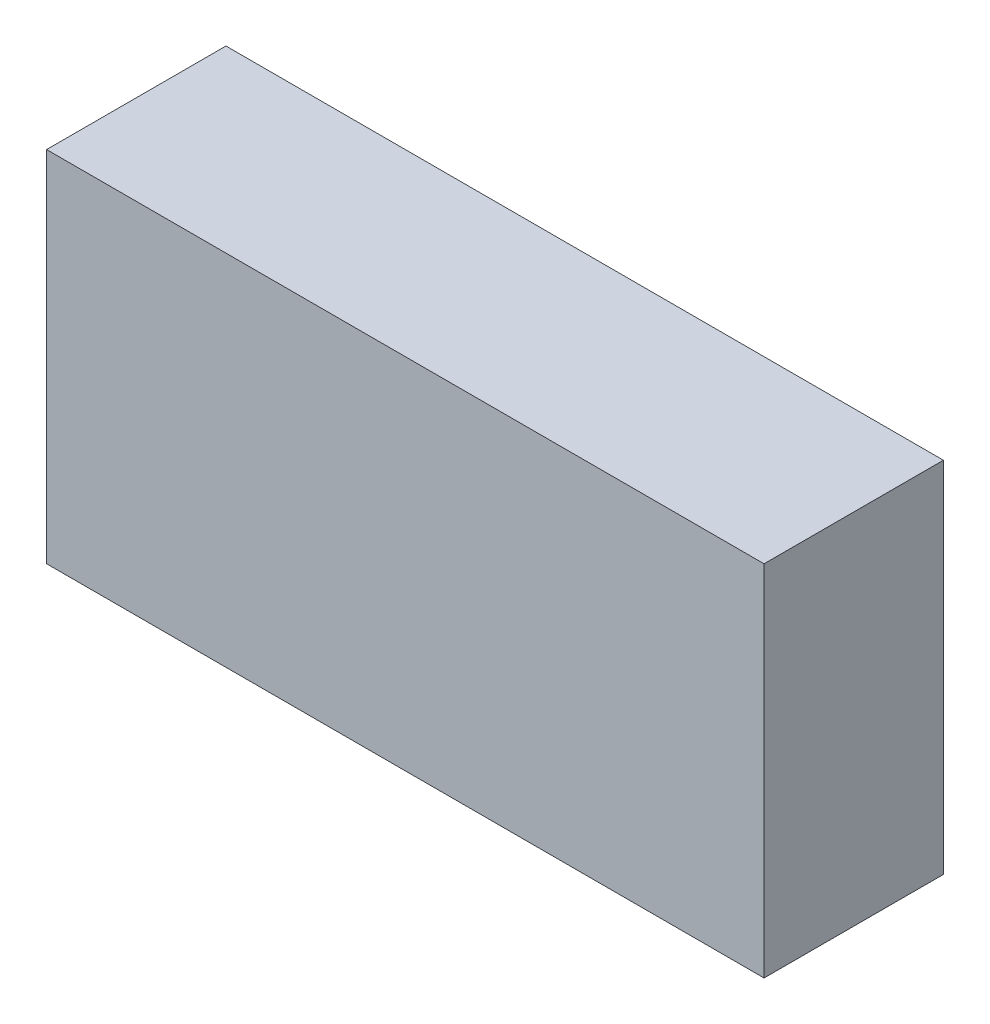
ISO-10303-21;
HEADER;
FILE_DESCRIPTION(('STEP AP214'),'2;1');
FILE_NAME('part.step','',(''),(''),'','','');
FILE_SCHEMA(('AUTOMOTIVE_DESIGN { 1 0 10303 214 1 1 1 1 }'));
ENDSEC;
DATA;
#1=APPLICATION_CONTEXT('core data for automotive mechanical design processes');
#2=APPLICATION_PROTOCOL_DEFINITION('international standard','automotive_design',2000,#1);
#3=PRODUCT_CONTEXT('',#1,'mechanical');
#4=PRODUCT('Part','Part','',(#3));
#5=PRODUCT_RELATED_PRODUCT_CATEGORY('part','',(#4));
#6=PRODUCT_DEFINITION_FORMATION('','',#4);
#7=PRODUCT_DEFINITION_CONTEXT('part definition',#1,'design');
#8=PRODUCT_DEFINITION('design','',#6,#7);
#9=PRODUCT_DEFINITION_SHAPE('','',#8);
#10=(LENGTH_UNIT() NAMED_UNIT(*) SI_UNIT(.MILLI.,.METRE.));
#11=(NAMED_UNIT(*) PLANE_ANGLE_UNIT() SI_UNIT($,.RADIAN.));
#12=(NAMED_UNIT(*) SI_UNIT($,.STERADIAN.) SOLID_ANGLE_UNIT());
#13=UNCERTAINTY_MEASURE_WITH_UNIT(LENGTH_MEASURE(1.E-05),#10,'distance_accuracy_value','');
#14=(GEOMETRIC_REPRESENTATION_CONTEXT(3) GLOBAL_UNCERTAINTY_ASSIGNED_CONTEXT((#13)) GLOBAL_UNIT_ASSIGNED_CONTEXT((#10,
#11,#12)) REPRESENTATION_CONTEXT('',''));
#15=CARTESIAN_POINT('',(0.,0.,0.));
#16=DIRECTION('',(0.,0.,1.));
#17=DIRECTION('',(1.,0.,0.));
#18=AXIS2_PLACEMENT_3D('',#15,#16,#17);
#19=CARTESIAN_POINT('',(0.,0.,10.));
#20=DIRECTION('',(1.,0.,0.));
#21=DIRECTION('',(0.,0.,-1.));
#22=AXIS2_PLACEMENT_3D('',#19,#20,#21);
#23=PLANE('',#22);
#24=DIRECTION('',(0.,-1.,0.));
#25=VECTOR('',#24,1.);
#26=CARTESIAN_POINT('',(0.,0.,0.));
#27=LINE('',#26,#25);
#28=CARTESIAN_POINT('',(0.,20.,0.));
#29=VERTEX_POINT('',#28);
#30=CARTESIAN_POINT('',(0.,0.,0.));
#31=VERTEX_POINT('',#30);
#32=EDGE_CURVE('E106',#29,#31,#27,.T.);
#33=ORIENTED_EDGE('',*,*,#32,.T.);
#34=DIRECTION('',(0.,0.,-1.));
#35=VECTOR('',#34,1.);
#36=CARTESIAN_POINT('',(0.,0.,10.));
#37=LINE('',#36,#35);
#38=CARTESIAN_POINT('',(0.,0.,10.));
#39=VERTEX_POINT('',#38);
#40=EDGE_CURVE('E11',#39,#31,#37,.T.);
#41=ORIENTED_EDGE('',*,*,#40,.F.);
#42=DIRECTION('',(0.,-1.,0.));
#43=VECTOR('',#42,1.);
#44=CARTESIAN_POINT('',(0.,0.,10.));
#45=LINE('',#44,#43);
#46=CARTESIAN_POINT('',(0.,20.,10.));
#47=VERTEX_POINT('',#46);
#48=EDGE_CURVE('E92',#47,#39,#45,.T.);
#49=ORIENTED_EDGE('',*,*,#48,.F.);
#50=DIRECTION('',(0.,0.,-1.));
#51=VECTOR('',#50,1.);
#52=CARTESIAN_POINT('',(0.,20.,10.));
#53=LINE('',#52,#51);
#54=EDGE_CURVE('E105',#47,#29,#53,.T.);
#55=ORIENTED_EDGE('',*,*,#54,.T.);
#56=EDGE_LOOP('',(#33,#41,#49,#55));
#57=FACE_BOUND('',#56,.T.);
#58=ADVANCED_FACE('F43',(#57),#23,.F.);
#59=CARTESIAN_POINT('',(0.,0.,10.));
#60=DIRECTION('',(0.,1.,0.));
#61=DIRECTION('',(0.,0.,1.));
#62=AXIS2_PLACEMENT_3D('',#59,#60,#61);
#63=PLANE('',#62);
#64=DIRECTION('',(1.,0.,0.));
#65=VECTOR('',#64,1.);
#66=CARTESIAN_POINT('',(0.,0.,0.));
#67=LINE('',#66,#65);
#68=CARTESIAN_POINT('',(40.,0.,0.));
#69=VERTEX_POINT('',#68);
#70=EDGE_CURVE('E97',#31,#69,#67,.T.);
#71=ORIENTED_EDGE('',*,*,#70,.T.);
#72=DIRECTION('',(0.,0.,-1.));
#73=VECTOR('',#72,1.);
#74=CARTESIAN_POINT('',(40.,0.,10.));
#75=LINE('',#74,#73);
#76=CARTESIAN_POINT('',(40.,0.,10.));
#77=VERTEX_POINT('',#76);
#78=EDGE_CURVE('E51',#77,#69,#75,.T.);
#79=ORIENTED_EDGE('',*,*,#78,.F.);
#80=DIRECTION('',(1.,0.,0.));
#81=VECTOR('',#80,1.);
#82=CARTESIAN_POINT('',(0.,0.,10.));
#83=LINE('',#82,#81);
#84=EDGE_CURVE('E87',#39,#77,#83,.T.);
#85=ORIENTED_EDGE('',*,*,#84,.F.);
#86=ORIENTED_EDGE('',*,*,#40,.T.);
#87=EDGE_LOOP('',(#71,#79,#85,#86));
#88=FACE_BOUND('',#87,.T.);
#89=ADVANCED_FACE('F100',(#88),#63,.F.);
#90=CARTESIAN_POINT('',(40.,0.,10.));
#91=DIRECTION('',(-1.,0.,0.));
#92=DIRECTION('',(0.,0.,1.));
#93=AXIS2_PLACEMENT_3D('',#90,#91,#92);
#94=PLANE('',#93);
#95=DIRECTION('',(0.,1.,0.));
#96=VECTOR('',#95,1.);
#97=CARTESIAN_POINT('',(40.,0.,0.));
#98=LINE('',#97,#96);
#99=CARTESIAN_POINT('',(40.,20.,0.));
#100=VERTEX_POINT('',#99);
#101=EDGE_CURVE('E78',#69,#100,#98,.T.);
#102=ORIENTED_EDGE('',*,*,#101,.T.);
#103=DIRECTION('',(0.,0.,-1.));
#104=VECTOR('',#103,1.);
#105=CARTESIAN_POINT('',(40.,20.,10.));
#106=LINE('',#105,#104);
#107=CARTESIAN_POINT('',(40.,20.,10.));
#108=VERTEX_POINT('',#107);
#109=EDGE_CURVE('E98',#108,#100,#106,.T.);
#110=ORIENTED_EDGE('',*,*,#109,.F.);
#111=DIRECTION('',(0.,1.,0.));
#112=VECTOR('',#111,1.);
#113=CARTESIAN_POINT('',(40.,0.,10.));
#114=LINE('',#113,#112);
#115=EDGE_CURVE('E95',#77,#108,#114,.T.);
#116=ORIENTED_EDGE('',*,*,#115,.F.);
#117=ORIENTED_EDGE('',*,*,#78,.T.);
#118=EDGE_LOOP('',(#102,#110,#116,#117));
#119=FACE_BOUND('',#118,.T.);
#120=ADVANCED_FACE('F99',(#119),#94,.F.);
#121=CARTESIAN_POINT('',(0.,20.,10.));
#122=DIRECTION('',(0.,-1.,0.));
#123=DIRECTION('',(0.,0.,-1.));
#124=AXIS2_PLACEMENT_3D('',#121,#122,#123);
#125=PLANE('',#124);
#126=DIRECTION('',(-1.,0.,0.));
#127=VECTOR('',#126,1.);
#128=CARTESIAN_POINT('',(0.,20.,0.));
#129=LINE('',#128,#127);
#130=EDGE_CURVE('E85',#100,#29,#129,.T.);
#131=ORIENTED_EDGE('',*,*,#130,.T.);
#132=ORIENTED_EDGE('',*,*,#54,.F.);
#133=DIRECTION('',(-1.,0.,0.));
#134=VECTOR('',#133,1.);
#135=CARTESIAN_POINT('',(0.,20.,10.));
#136=LINE('',#135,#134);
#137=EDGE_CURVE('E56',#108,#47,#136,.T.);
#138=ORIENTED_EDGE('',*,*,#137,.F.);
#139=ORIENTED_EDGE('',*,*,#109,.T.);
#140=EDGE_LOOP('',(#131,#132,#138,#139));
#141=FACE_BOUND('',#140,.T.);
#142=ADVANCED_FACE('F111',(#141),#125,.F.);
#143=CARTESIAN_POINT('',(0.,0.,10.));
#144=DIRECTION('',(0.,0.,-1.));
#145=DIRECTION('',(-1.,0.,0.));
#146=AXIS2_PLACEMENT_3D('',#143,#144,#145);
#147=PLANE('',#146);
#148=ORIENTED_EDGE('',*,*,#48,.T.);
#149=ORIENTED_EDGE('',*,*,#84,.T.);
#150=ORIENTED_EDGE('',*,*,#115,.T.);
#151=ORIENTED_EDGE('',*,*,#137,.T.);
#152=EDGE_LOOP('',(#148,#149,#150,#151));
#153=FACE_BOUND('',#152,.T.);
#154=ADVANCED_FACE('F89',(#153),#147,.F.);
#155=CARTESIAN_POINT('',(0.,0.,0.));
#156=DIRECTION('',(0.,0.,-1.));
#157=DIRECTION('',(-1.,0.,0.));
#158=AXIS2_PLACEMENT_3D('',#155,#156,#157);
#159=PLANE('',#158);
#160=ORIENTED_EDGE('',*,*,#32,.F.);
#161=ORIENTED_EDGE('',*,*,#130,.F.);
#162=ORIENTED_EDGE('',*,*,#101,.F.);
#163=ORIENTED_EDGE('',*,*,#70,.F.);
#164=EDGE_LOOP('',(#160,#161,#162,#163));
#165=FACE_BOUND('',#164,.T.);
#166=ADVANCED_FACE('F116',(#165),#159,.T.);
#167=CLOSED_SHELL('',(#58,#89,#120,#142,#154,#166));
#168=MANIFOLD_SOLID_BREP('B2',#167);
#169=ADVANCED_BREP_SHAPE_REPRESENTATION('',(#18,#168),#14);
#170=SHAPE_DEFINITION_REPRESENTATION(#9,#169);
ENDSEC;
END-ISO-10303-21;
